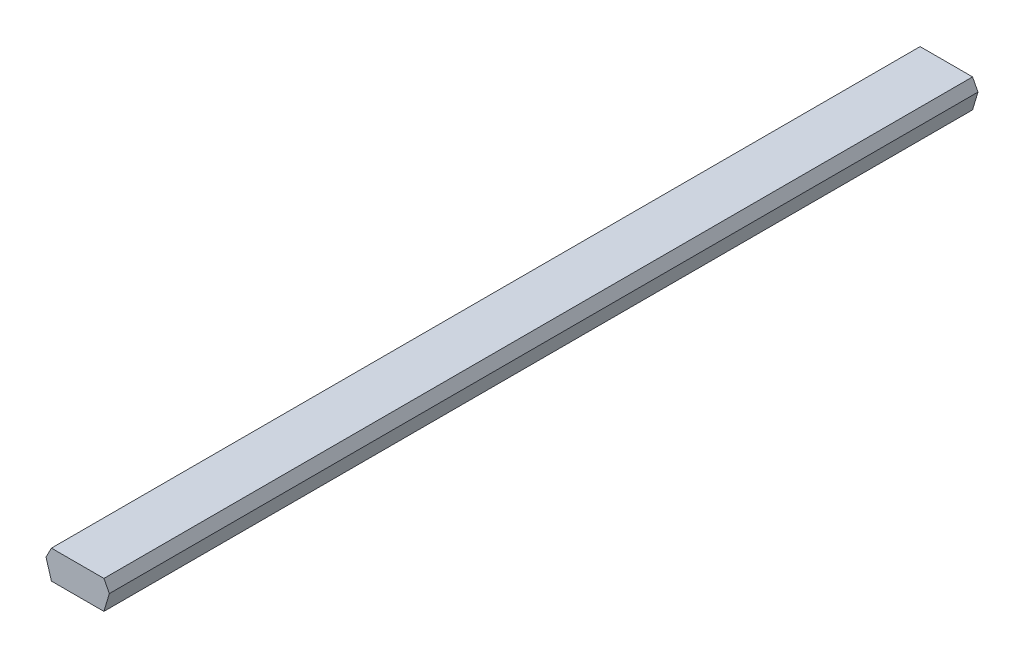
ISO-10303-21;
HEADER;
FILE_DESCRIPTION(('STEP AP214'),'2;1');
FILE_NAME('part.step','',(''),(''),'','','');
FILE_SCHEMA(('AUTOMOTIVE_DESIGN { 1 0 10303 214 1 1 1 1 }'));
ENDSEC;
DATA;
#1=APPLICATION_CONTEXT('core data for automotive mechanical design processes');
#2=APPLICATION_PROTOCOL_DEFINITION('international standard','automotive_design',2000,#1);
#3=PRODUCT_CONTEXT('',#1,'mechanical');
#4=PRODUCT('Part','Part','',(#3));
#5=PRODUCT_RELATED_PRODUCT_CATEGORY('part','',(#4));
#6=PRODUCT_DEFINITION_FORMATION('','',#4);
#7=PRODUCT_DEFINITION_CONTEXT('part definition',#1,'design');
#8=PRODUCT_DEFINITION('design','',#6,#7);
#9=PRODUCT_DEFINITION_SHAPE('','',#8);
#10=(LENGTH_UNIT() NAMED_UNIT(*) SI_UNIT(.MILLI.,.METRE.));
#11=(NAMED_UNIT(*) PLANE_ANGLE_UNIT() SI_UNIT($,.RADIAN.));
#12=(NAMED_UNIT(*) SI_UNIT($,.STERADIAN.) SOLID_ANGLE_UNIT());
#13=UNCERTAINTY_MEASURE_WITH_UNIT(LENGTH_MEASURE(1.E-05),#10,'distance_accuracy_value','');
#14=(GEOMETRIC_REPRESENTATION_CONTEXT(3) GLOBAL_UNCERTAINTY_ASSIGNED_CONTEXT((#13)) GLOBAL_UNIT_ASSIGNED_CONTEXT((#10,
#11,#12)) REPRESENTATION_CONTEXT('',''));
#15=CARTESIAN_POINT('',(0.,0.,0.));
#16=DIRECTION('',(0.,0.,1.));
#17=DIRECTION('',(1.,0.,0.));
#18=AXIS2_PLACEMENT_3D('',#15,#16,#17);
#19=CARTESIAN_POINT('',(36.83,20.066,1219.2));
#20=DIRECTION('',(-0.887120199590061,-0.461538461538461,0.));
#21=DIRECTION('',(0.461538461538461,-0.887120199590061,0.));
#22=AXIS2_PLACEMENT_3D('',#19,#20,#21);
#23=PLANE('',#22);
#24=DIRECTION('',(-0.461538461538461,0.887120199590061,0.));
#25=VECTOR('',#24,1.);
#26=CARTESIAN_POINT('',(36.83,20.066,0.));
#27=LINE('',#26,#25);
#28=CARTESIAN_POINT('',(44.45,5.41964550476809,0.));
#29=VERTEX_POINT('',#28);
#30=CARTESIAN_POINT('',(36.83,20.066,0.));
#31=VERTEX_POINT('',#30);
#32=EDGE_CURVE('E134',#29,#31,#27,.T.);
#33=ORIENTED_EDGE('',*,*,#32,.T.);
#34=DIRECTION('',(0.,0.,-1.));
#35=VECTOR('',#34,1.);
#36=CARTESIAN_POINT('',(36.83,20.066,1219.2));
#37=LINE('',#36,#35);
#38=CARTESIAN_POINT('',(36.83,20.066,1219.2));
#39=VERTEX_POINT('',#38);
#40=EDGE_CURVE('E11',#39,#31,#37,.T.);
#41=ORIENTED_EDGE('',*,*,#40,.F.);
#42=DIRECTION('',(-0.461538461538461,0.887120199590061,0.));
#43=VECTOR('',#42,1.);
#44=CARTESIAN_POINT('',(36.83,20.066,1219.2));
#45=LINE('',#44,#43);
#46=CARTESIAN_POINT('',(44.45,5.41964550476809,1219.2));
#47=VERTEX_POINT('',#46);
#48=EDGE_CURVE('E150',#47,#39,#45,.T.);
#49=ORIENTED_EDGE('',*,*,#48,.F.);
#50=DIRECTION('',(0.,0.,-1.));
#51=VECTOR('',#50,1.);
#52=CARTESIAN_POINT('',(44.45,5.41964550476809,1219.2));
#53=LINE('',#52,#51);
#54=EDGE_CURVE('E130',#47,#29,#53,.T.);
#55=ORIENTED_EDGE('',*,*,#54,.T.);
#56=EDGE_LOOP('',(#33,#41,#49,#55));
#57=FACE_BOUND('',#56,.T.);
#58=ADVANCED_FACE('F45',(#57),#23,.F.);
#59=CARTESIAN_POINT('',(-36.83,20.066,1219.2));
#60=DIRECTION('',(0.,-1.,0.));
#61=DIRECTION('',(0.,0.,-1.));
#62=AXIS2_PLACEMENT_3D('',#59,#60,#61);
#63=PLANE('',#62);
#64=DIRECTION('',(-1.,0.,0.));
#65=VECTOR('',#64,1.);
#66=CARTESIAN_POINT('',(-36.83,20.066,0.));
#67=LINE('',#66,#65);
#68=CARTESIAN_POINT('',(-36.83,20.066,0.));
#69=VERTEX_POINT('',#68);
#70=EDGE_CURVE('E138',#31,#69,#67,.T.);
#71=ORIENTED_EDGE('',*,*,#70,.T.);
#72=DIRECTION('',(0.,0.,-1.));
#73=VECTOR('',#72,1.);
#74=CARTESIAN_POINT('',(-36.83,20.066,1219.2));
#75=LINE('',#74,#73);
#76=CARTESIAN_POINT('',(-36.83,20.066,1219.2));
#77=VERTEX_POINT('',#76);
#78=EDGE_CURVE('E54',#77,#69,#75,.T.);
#79=ORIENTED_EDGE('',*,*,#78,.F.);
#80=DIRECTION('',(-1.,0.,0.));
#81=VECTOR('',#80,1.);
#82=CARTESIAN_POINT('',(-36.83,20.066,1219.2));
#83=LINE('',#82,#81);
#84=EDGE_CURVE('E99',#39,#77,#83,.T.);
#85=ORIENTED_EDGE('',*,*,#84,.F.);
#86=ORIENTED_EDGE('',*,*,#40,.T.);
#87=EDGE_LOOP('',(#71,#79,#85,#86));
#88=FACE_BOUND('',#87,.T.);
#89=ADVANCED_FACE('F178',(#88),#63,.F.);
#90=CARTESIAN_POINT('',(-44.45,5.41964550476809,1219.2));
#91=DIRECTION('',(0.887120199590061,-0.461538461538462,0.));
#92=DIRECTION('',(0.461538461538462,0.887120199590061,0.));
#93=AXIS2_PLACEMENT_3D('',#90,#91,#92);
#94=PLANE('',#93);
#95=DIRECTION('',(-0.461538461538462,-0.887120199590061,0.));
#96=VECTOR('',#95,1.);
#97=CARTESIAN_POINT('',(-44.45,5.41964550476809,0.));
#98=LINE('',#97,#96);
#99=CARTESIAN_POINT('',(-44.45,5.41964550476809,0.));
#100=VERTEX_POINT('',#99);
#101=EDGE_CURVE('E141',#69,#100,#98,.T.);
#102=ORIENTED_EDGE('',*,*,#101,.T.);
#103=DIRECTION('',(0.,0.,-1.));
#104=VECTOR('',#103,1.);
#105=CARTESIAN_POINT('',(-44.45,5.41964550476809,1219.2));
#106=LINE('',#105,#104);
#107=CARTESIAN_POINT('',(-44.45,5.41964550476809,1219.2));
#108=VERTEX_POINT('',#107);
#109=EDGE_CURVE('E123',#108,#100,#106,.T.);
#110=ORIENTED_EDGE('',*,*,#109,.F.);
#111=DIRECTION('',(-0.461538461538462,-0.887120199590061,0.));
#112=VECTOR('',#111,1.);
#113=CARTESIAN_POINT('',(-44.45,5.41964550476809,1219.2));
#114=LINE('',#113,#112);
#115=EDGE_CURVE('E112',#77,#108,#114,.T.);
#116=ORIENTED_EDGE('',*,*,#115,.F.);
#117=ORIENTED_EDGE('',*,*,#78,.T.);
#118=EDGE_LOOP('',(#102,#110,#116,#117));
#119=FACE_BOUND('',#118,.T.);
#120=ADVANCED_FACE('F160',(#119),#94,.F.);
#121=CARTESIAN_POINT('',(-36.83,-20.066,1219.2));
#122=DIRECTION('',(0.95809172246163,0.286461605368864,0.));
#123=DIRECTION('',(-0.286461605368864,0.95809172246163,0.));
#124=AXIS2_PLACEMENT_3D('',#121,#122,#123);
#125=PLANE('',#124);
#126=DIRECTION('',(0.286461605368864,-0.95809172246163,0.));
#127=VECTOR('',#126,1.);
#128=CARTESIAN_POINT('',(-36.83,-20.066,0.));
#129=LINE('',#128,#127);
#130=CARTESIAN_POINT('',(-36.83,-20.066,0.));
#131=VERTEX_POINT('',#130);
#132=EDGE_CURVE('E121',#100,#131,#129,.T.);
#133=ORIENTED_EDGE('',*,*,#132,.T.);
#134=DIRECTION('',(0.,0.,-1.));
#135=VECTOR('',#134,1.);
#136=CARTESIAN_POINT('',(-36.83,-20.066,1219.2));
#137=LINE('',#136,#135);
#138=CARTESIAN_POINT('',(-36.83,-20.066,1219.2));
#139=VERTEX_POINT('',#138);
#140=EDGE_CURVE('E118',#139,#131,#137,.T.);
#141=ORIENTED_EDGE('',*,*,#140,.F.);
#142=DIRECTION('',(0.286461605368864,-0.95809172246163,0.));
#143=VECTOR('',#142,1.);
#144=CARTESIAN_POINT('',(-36.83,-20.066,1219.2));
#145=LINE('',#144,#143);
#146=EDGE_CURVE('E106',#108,#139,#145,.T.);
#147=ORIENTED_EDGE('',*,*,#146,.F.);
#148=ORIENTED_EDGE('',*,*,#109,.T.);
#149=EDGE_LOOP('',(#133,#141,#147,#148));
#150=FACE_BOUND('',#149,.T.);
#151=ADVANCED_FACE('F119',(#150),#125,.F.);
#152=CARTESIAN_POINT('',(-36.83,-20.066,1219.2));
#153=DIRECTION('',(0.,1.,0.));
#154=DIRECTION('',(0.,0.,1.));
#155=AXIS2_PLACEMENT_3D('',#152,#153,#154);
#156=PLANE('',#155);
#157=DIRECTION('',(1.,0.,0.));
#158=VECTOR('',#157,1.);
#159=CARTESIAN_POINT('',(-36.83,-20.066,0.));
#160=LINE('',#159,#158);
#161=CARTESIAN_POINT('',(36.83,-20.066,0.));
#162=VERTEX_POINT('',#161);
#163=EDGE_CURVE('E85',#131,#162,#160,.T.);
#164=ORIENTED_EDGE('',*,*,#163,.T.);
#165=DIRECTION('',(0.,0.,-1.));
#166=VECTOR('',#165,1.);
#167=CARTESIAN_POINT('',(36.83,-20.066,1219.2));
#168=LINE('',#167,#166);
#169=CARTESIAN_POINT('',(36.83,-20.066,1219.2));
#170=VERTEX_POINT('',#169);
#171=EDGE_CURVE('E124',#170,#162,#168,.T.);
#172=ORIENTED_EDGE('',*,*,#171,.F.);
#173=DIRECTION('',(1.,0.,0.));
#174=VECTOR('',#173,1.);
#175=CARTESIAN_POINT('',(-36.83,-20.066,1219.2));
#176=LINE('',#175,#174);
#177=EDGE_CURVE('E110',#139,#170,#176,.T.);
#178=ORIENTED_EDGE('',*,*,#177,.F.);
#179=ORIENTED_EDGE('',*,*,#140,.T.);
#180=EDGE_LOOP('',(#164,#172,#178,#179));
#181=FACE_BOUND('',#180,.T.);
#182=ADVANCED_FACE('F126',(#181),#156,.F.);
#183=CARTESIAN_POINT('',(44.45,5.41964550476809,1219.2));
#184=DIRECTION('',(-0.95809172246163,0.286461605368863,0.));
#185=DIRECTION('',(-0.286461605368863,-0.95809172246163,0.));
#186=AXIS2_PLACEMENT_3D('',#183,#184,#185);
#187=PLANE('',#186);
#188=DIRECTION('',(0.286461605368863,0.95809172246163,0.));
#189=VECTOR('',#188,1.);
#190=CARTESIAN_POINT('',(44.45,5.41964550476809,0.));
#191=LINE('',#190,#189);
#192=EDGE_CURVE('E91',#162,#29,#191,.T.);
#193=ORIENTED_EDGE('',*,*,#192,.T.);
#194=ORIENTED_EDGE('',*,*,#54,.F.);
#195=DIRECTION('',(0.286461605368863,0.95809172246163,0.));
#196=VECTOR('',#195,1.);
#197=CARTESIAN_POINT('',(44.45,5.41964550476809,1219.2));
#198=LINE('',#197,#196);
#199=EDGE_CURVE('E62',#170,#47,#198,.T.);
#200=ORIENTED_EDGE('',*,*,#199,.F.);
#201=ORIENTED_EDGE('',*,*,#171,.T.);
#202=EDGE_LOOP('',(#193,#194,#200,#201));
#203=FACE_BOUND('',#202,.T.);
#204=ADVANCED_FACE('F167',(#203),#187,.F.);
#205=CARTESIAN_POINT('',(0.,0.,1219.2));
#206=DIRECTION('',(0.,0.,1.));
#207=DIRECTION('',(1.,0.,0.));
#208=AXIS2_PLACEMENT_3D('',#205,#206,#207);
#209=PLANE('',#208);
#210=ORIENTED_EDGE('',*,*,#48,.T.);
#211=ORIENTED_EDGE('',*,*,#84,.T.);
#212=ORIENTED_EDGE('',*,*,#115,.T.);
#213=ORIENTED_EDGE('',*,*,#146,.T.);
#214=ORIENTED_EDGE('',*,*,#177,.T.);
#215=ORIENTED_EDGE('',*,*,#199,.T.);
#216=EDGE_LOOP('',(#210,#211,#212,#213,#214,#215));
#217=FACE_BOUND('',#216,.T.);
#218=ADVANCED_FACE('F108',(#217),#209,.T.);
#219=CARTESIAN_POINT('',(0.,0.,0.));
#220=DIRECTION('',(0.,0.,1.));
#221=DIRECTION('',(1.,0.,0.));
#222=AXIS2_PLACEMENT_3D('',#219,#220,#221);
#223=PLANE('',#222);
#224=ORIENTED_EDGE('',*,*,#32,.F.);
#225=ORIENTED_EDGE('',*,*,#192,.F.);
#226=ORIENTED_EDGE('',*,*,#163,.F.);
#227=ORIENTED_EDGE('',*,*,#132,.F.);
#228=ORIENTED_EDGE('',*,*,#101,.F.);
#229=ORIENTED_EDGE('',*,*,#70,.F.);
#230=EDGE_LOOP('',(#224,#225,#226,#227,#228,#229));
#231=FACE_BOUND('',#230,.T.);
#232=ADVANCED_FACE('F163',(#231),#223,.F.);
#233=CLOSED_SHELL('',(#58,#89,#120,#151,#182,#204,#218,#232));
#234=MANIFOLD_SOLID_BREP('B2',#233);
#235=ADVANCED_BREP_SHAPE_REPRESENTATION('',(#18,#234),#14);
#236=SHAPE_DEFINITION_REPRESENTATION(#9,#235);
ENDSEC;
END-ISO-10303-21;
